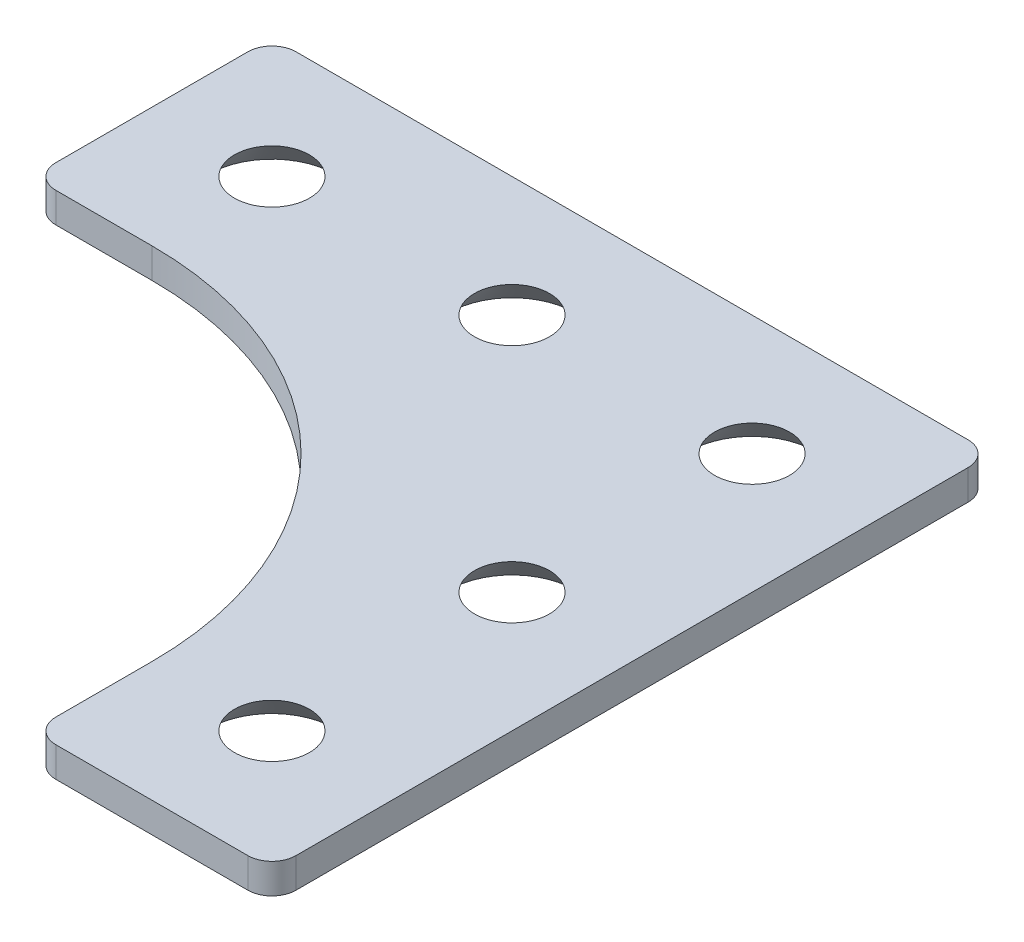
ISO-10303-21;
HEADER;
FILE_DESCRIPTION(('STEP AP214'),'2;1');
FILE_NAME('part.step','',(''),(''),'','','');
FILE_SCHEMA(('AUTOMOTIVE_DESIGN { 1 0 10303 214 1 1 1 1 }'));
ENDSEC;
DATA;
#1=APPLICATION_CONTEXT('core data for automotive mechanical design processes');
#2=APPLICATION_PROTOCOL_DEFINITION('international standard','automotive_design',2000,#1);
#3=PRODUCT_CONTEXT('',#1,'mechanical');
#4=PRODUCT('Part','Part','',(#3));
#5=PRODUCT_RELATED_PRODUCT_CATEGORY('part','',(#4));
#6=PRODUCT_DEFINITION_FORMATION('','',#4);
#7=PRODUCT_DEFINITION_CONTEXT('part definition',#1,'design');
#8=PRODUCT_DEFINITION('design','',#6,#7);
#9=PRODUCT_DEFINITION_SHAPE('','',#8);
#10=(LENGTH_UNIT() NAMED_UNIT(*) SI_UNIT(.MILLI.,.METRE.));
#11=(NAMED_UNIT(*) PLANE_ANGLE_UNIT() SI_UNIT($,.RADIAN.));
#12=(NAMED_UNIT(*) SI_UNIT($,.STERADIAN.) SOLID_ANGLE_UNIT());
#13=UNCERTAINTY_MEASURE_WITH_UNIT(LENGTH_MEASURE(1.E-05),#10,'distance_accuracy_value','');
#14=(GEOMETRIC_REPRESENTATION_CONTEXT(3) GLOBAL_UNCERTAINTY_ASSIGNED_CONTEXT((#13)) GLOBAL_UNIT_ASSIGNED_CONTEXT((#10,
#11,#12)) REPRESENTATION_CONTEXT('',''));
#15=CARTESIAN_POINT('',(0.,0.,0.));
#16=DIRECTION('',(0.,0.,1.));
#17=DIRECTION('',(1.,0.,0.));
#18=AXIS2_PLACEMENT_3D('',#15,#16,#17);
#19=CARTESIAN_POINT('',(274.893771244465,3.175,-266.67115375047));
#20=DIRECTION('',(0.,-1.,0.));
#21=DIRECTION('',(0.,0.,-1.));
#22=AXIS2_PLACEMENT_3D('',#19,#20,#21);
#23=PLANE('',#22);
#24=CARTESIAN_POINT('',(264.733771244466,3.175,-205.711153750467));
#25=DIRECTION('',(0.,-1.,0.));
#26=DIRECTION('',(0.,0.,-1.));
#27=AXIS2_PLACEMENT_3D('',#24,#25,#26);
#28=CIRCLE('',#27,3.97101460743346);
#29=CARTESIAN_POINT('',(264.733771244466,3.175,-209.682168357901));
#30=VERTEX_POINT('',#29);
#31=EDGE_CURVE('E47',#30,#30,#28,.T.);
#32=ORIENTED_EDGE('',*,*,#31,.T.);
#33=EDGE_LOOP('',(#32));
#34=FACE_BOUND('',#33,.T.);
#35=CARTESIAN_POINT('',(264.733771244466,3.175,-231.111153750467));
#36=DIRECTION('',(0.,-1.,0.));
#37=DIRECTION('',(0.,0.,-1.));
#38=AXIS2_PLACEMENT_3D('',#35,#36,#37);
#39=CIRCLE('',#38,3.97101460743346);
#40=CARTESIAN_POINT('',(264.733771244466,3.175,-235.082168357901));
#41=VERTEX_POINT('',#40);
#42=EDGE_CURVE('E238',#41,#41,#39,.T.);
#43=ORIENTED_EDGE('',*,*,#42,.T.);
#44=EDGE_LOOP('',(#43));
#45=FACE_BOUND('',#44,.T.);
#46=CARTESIAN_POINT('',(264.733771244466,3.175,-256.511153750471));
#47=DIRECTION('',(0.,-1.,0.));
#48=DIRECTION('',(0.,0.,-1.));
#49=AXIS2_PLACEMENT_3D('',#46,#47,#48);
#50=CIRCLE('',#49,3.97101460743346);
#51=CARTESIAN_POINT('',(264.733771244466,3.175,-260.482168357905));
#52=VERTEX_POINT('',#51);
#53=EDGE_CURVE('E248',#52,#52,#50,.T.);
#54=ORIENTED_EDGE('',*,*,#53,.T.);
#55=EDGE_LOOP('',(#54));
#56=FACE_BOUND('',#55,.T.);
#57=CARTESIAN_POINT('',(239.333771244467,3.175,-256.511153750469));
#58=DIRECTION('',(0.,-1.,0.));
#59=DIRECTION('',(0.,0.,-1.));
#60=AXIS2_PLACEMENT_3D('',#57,#58,#59);
#61=CIRCLE('',#60,3.97101460743349);
#62=CARTESIAN_POINT('',(239.333771244467,3.175,-260.482168357903));
#63=VERTEX_POINT('',#62);
#64=EDGE_CURVE('E266',#63,#63,#61,.T.);
#65=ORIENTED_EDGE('',*,*,#64,.T.);
#66=EDGE_LOOP('',(#65));
#67=FACE_BOUND('',#66,.T.);
#68=CARTESIAN_POINT('',(213.933771244467,3.175,-256.511153750469));
#69=DIRECTION('',(0.,-1.,0.));
#70=DIRECTION('',(0.,0.,-1.));
#71=AXIS2_PLACEMENT_3D('',#68,#69,#70);
#72=CIRCLE('',#71,3.97101460743349);
#73=CARTESIAN_POINT('',(213.933771244467,3.175,-260.482168357903));
#74=VERTEX_POINT('',#73);
#75=EDGE_CURVE('E175',#74,#74,#72,.T.);
#76=ORIENTED_EDGE('',*,*,#75,.T.);
#77=EDGE_LOOP('',(#76));
#78=FACE_BOUND('',#77,.T.);
#79=CARTESIAN_POINT('',(274.893771244465,3.175,-266.67115375047));
#80=DIRECTION('',(0.,1.,0.));
#81=DIRECTION('',(0.,0.,-1.));
#82=AXIS2_PLACEMENT_3D('',#79,#80,#81);
#83=CIRCLE('',#82,2.54000000000001);
#84=CARTESIAN_POINT('',(277.433771244465,3.175,-266.67115375047));
#85=VERTEX_POINT('',#84);
#86=CARTESIAN_POINT('',(274.893771244465,3.175,-269.21115375047));
#87=VERTEX_POINT('',#86);
#88=EDGE_CURVE('E205',#85,#87,#83,.T.);
#89=ORIENTED_EDGE('',*,*,#88,.T.);
#90=DIRECTION('',(-1.,0.,0.));
#91=VECTOR('',#90,1.);
#92=CARTESIAN_POINT('',(274.893771244465,3.175,-269.21115375047));
#93=LINE('',#92,#91);
#94=CARTESIAN_POINT('',(203.773771244465,3.175,-269.21115375047));
#95=VERTEX_POINT('',#94);
#96=EDGE_CURVE('E118',#87,#95,#93,.T.);
#97=ORIENTED_EDGE('',*,*,#96,.T.);
#98=CARTESIAN_POINT('',(203.773771244465,3.175,-266.67115375047));
#99=DIRECTION('',(0.,1.,0.));
#100=DIRECTION('',(0.,0.,-1.));
#101=AXIS2_PLACEMENT_3D('',#98,#99,#100);
#102=CIRCLE('',#101,2.53999999999999);
#103=CARTESIAN_POINT('',(201.233771244465,3.175,-266.67115375047));
#104=VERTEX_POINT('',#103);
#105=EDGE_CURVE('E281',#95,#104,#102,.T.);
#106=ORIENTED_EDGE('',*,*,#105,.T.);
#107=DIRECTION('',(0.,0.,1.));
#108=VECTOR('',#107,1.);
#109=CARTESIAN_POINT('',(201.233771244465,3.175,-266.67115375047));
#110=LINE('',#109,#108);
#111=CARTESIAN_POINT('',(201.233771244465,3.175,-246.351153750469));
#112=VERTEX_POINT('',#111);
#113=EDGE_CURVE('E284',#104,#112,#110,.T.);
#114=ORIENTED_EDGE('',*,*,#113,.T.);
#115=CARTESIAN_POINT('',(203.773771244465,3.175,-246.351153750469));
#116=DIRECTION('',(0.,1.,0.));
#117=DIRECTION('',(0.,0.,-1.));
#118=AXIS2_PLACEMENT_3D('',#115,#116,#117);
#119=CIRCLE('',#118,2.53999999999999);
#120=CARTESIAN_POINT('',(203.773771244465,3.175,-243.811153750469));
#121=VERTEX_POINT('',#120);
#122=EDGE_CURVE('E287',#112,#121,#119,.T.);
#123=ORIENTED_EDGE('',*,*,#122,.T.);
#124=DIRECTION('',(1.,0.,0.));
#125=VECTOR('',#124,1.);
#126=CARTESIAN_POINT('',(203.773771244465,3.175,-243.811153750469));
#127=LINE('',#126,#125);
#128=CARTESIAN_POINT('',(213.933771244466,3.175,-243.811153750469));
#129=VERTEX_POINT('',#128);
#130=EDGE_CURVE('E290',#121,#129,#127,.T.);
#131=ORIENTED_EDGE('',*,*,#130,.T.);
#132=CARTESIAN_POINT('',(213.933771244466,3.175,-205.711153750469));
#133=DIRECTION('',(0.,-1.,0.));
#134=DIRECTION('',(0.,0.,1.));
#135=AXIS2_PLACEMENT_3D('',#132,#133,#134);
#136=CIRCLE('',#135,38.1);
#137=CARTESIAN_POINT('',(252.033771244467,3.175,-205.711153750471));
#138=VERTEX_POINT('',#137);
#139=EDGE_CURVE('E293',#129,#138,#136,.T.);
#140=ORIENTED_EDGE('',*,*,#139,.T.);
#141=DIRECTION('',(0.,0.,1.));
#142=VECTOR('',#141,1.);
#143=CARTESIAN_POINT('',(252.033771244467,3.175,-205.711153750471));
#144=LINE('',#143,#142);
#145=CARTESIAN_POINT('',(252.033771244467,3.175,-195.551153750469));
#146=VERTEX_POINT('',#145);
#147=EDGE_CURVE('E296',#138,#146,#144,.T.);
#148=ORIENTED_EDGE('',*,*,#147,.T.);
#149=CARTESIAN_POINT('',(254.573771244467,3.175,-195.551153750469));
#150=DIRECTION('',(0.,1.,0.));
#151=DIRECTION('',(0.,0.,-1.));
#152=AXIS2_PLACEMENT_3D('',#149,#150,#151);
#153=CIRCLE('',#152,2.53999999999999);
#154=CARTESIAN_POINT('',(254.573771244467,3.175,-193.011153750469));
#155=VERTEX_POINT('',#154);
#156=EDGE_CURVE('E148',#146,#155,#153,.T.);
#157=ORIENTED_EDGE('',*,*,#156,.T.);
#158=DIRECTION('',(1.,0.,0.));
#159=VECTOR('',#158,1.);
#160=CARTESIAN_POINT('',(254.573771244467,3.175,-193.011153750469));
#161=LINE('',#160,#159);
#162=CARTESIAN_POINT('',(274.893771244467,3.175,-193.011153750469));
#163=VERTEX_POINT('',#162);
#164=EDGE_CURVE('E143',#155,#163,#161,.T.);
#165=ORIENTED_EDGE('',*,*,#164,.T.);
#166=CARTESIAN_POINT('',(274.893771244467,3.175,-195.551153750469));
#167=DIRECTION('',(0.,1.,0.));
#168=DIRECTION('',(0.,0.,-1.));
#169=AXIS2_PLACEMENT_3D('',#166,#167,#168);
#170=CIRCLE('',#169,2.54000000000001);
#171=CARTESIAN_POINT('',(277.433771244467,3.175,-195.551153750469));
#172=VERTEX_POINT('',#171);
#173=EDGE_CURVE('E146',#163,#172,#170,.T.);
#174=ORIENTED_EDGE('',*,*,#173,.T.);
#175=DIRECTION('',(0.,0.,-1.));
#176=VECTOR('',#175,1.);
#177=CARTESIAN_POINT('',(277.433771244467,3.175,-195.551153750469));
#178=LINE('',#177,#176);
#179=EDGE_CURVE('E63',#172,#85,#178,.T.);
#180=ORIENTED_EDGE('',*,*,#179,.T.);
#181=EDGE_LOOP('',(#89,#97,#106,#114,#123,#131,#140,#148,#157,#165,#174,#180));
#182=FACE_BOUND('',#181,.T.);
#183=ADVANCED_FACE('F43',(#34,#45,#56,#67,#78,#182),#23,.F.);
#184=CARTESIAN_POINT('',(274.893771244465,3.175,-266.67115375047));
#185=DIRECTION('',(0.,-1.,0.));
#186=DIRECTION('',(0.,0.,-1.));
#187=AXIS2_PLACEMENT_3D('',#184,#185,#186);
#188=CYLINDRICAL_SURFACE('',#187,2.54000000000001);
#189=CARTESIAN_POINT('',(274.893771244465,0.,-266.67115375047));
#190=DIRECTION('',(0.,1.,0.));
#191=DIRECTION('',(0.,0.,-1.));
#192=AXIS2_PLACEMENT_3D('',#189,#190,#191);
#193=CIRCLE('',#192,2.54000000000001);
#194=CARTESIAN_POINT('',(277.433771244465,0.,-266.67115375047));
#195=VERTEX_POINT('',#194);
#196=CARTESIAN_POINT('',(274.893771244465,0.,-269.21115375047));
#197=VERTEX_POINT('',#196);
#198=EDGE_CURVE('E170',#195,#197,#193,.T.);
#199=ORIENTED_EDGE('',*,*,#198,.T.);
#200=DIRECTION('',(0.,-1.,0.));
#201=VECTOR('',#200,1.);
#202=CARTESIAN_POINT('',(274.893771244465,3.175,-269.21115375047));
#203=LINE('',#202,#201);
#204=EDGE_CURVE('E11',#87,#197,#203,.T.);
#205=ORIENTED_EDGE('',*,*,#204,.F.);
#206=ORIENTED_EDGE('',*,*,#88,.F.);
#207=DIRECTION('',(0.,-1.,0.));
#208=VECTOR('',#207,1.);
#209=CARTESIAN_POINT('',(277.433771244465,3.175,-266.67115375047));
#210=LINE('',#209,#208);
#211=EDGE_CURVE('E166',#85,#195,#210,.T.);
#212=ORIENTED_EDGE('',*,*,#211,.T.);
#213=EDGE_LOOP('',(#199,#205,#206,#212));
#214=FACE_BOUND('',#213,.T.);
#215=ADVANCED_FACE('F45',(#214),#188,.T.);
#216=CARTESIAN_POINT('',(274.893771244465,3.175,-269.21115375047));
#217=DIRECTION('',(0.,0.,1.));
#218=DIRECTION('',(1.,0.,0.));
#219=AXIS2_PLACEMENT_3D('',#216,#217,#218);
#220=PLANE('',#219);
#221=DIRECTION('',(-1.,0.,0.));
#222=VECTOR('',#221,1.);
#223=CARTESIAN_POINT('',(274.893771244465,0.,-269.21115375047));
#224=LINE('',#223,#222);
#225=CARTESIAN_POINT('',(203.773771244465,0.,-269.21115375047));
#226=VERTEX_POINT('',#225);
#227=EDGE_CURVE('E174',#197,#226,#224,.T.);
#228=ORIENTED_EDGE('',*,*,#227,.T.);
#229=DIRECTION('',(0.,-1.,0.));
#230=VECTOR('',#229,1.);
#231=CARTESIAN_POINT('',(203.773771244465,3.175,-269.21115375047));
#232=LINE('',#231,#230);
#233=EDGE_CURVE('E54',#95,#226,#232,.T.);
#234=ORIENTED_EDGE('',*,*,#233,.F.);
#235=ORIENTED_EDGE('',*,*,#96,.F.);
#236=ORIENTED_EDGE('',*,*,#204,.T.);
#237=EDGE_LOOP('',(#228,#234,#235,#236));
#238=FACE_BOUND('',#237,.T.);
#239=ADVANCED_FACE('F333',(#238),#220,.F.);
#240=CARTESIAN_POINT('',(203.773771244465,3.175,-266.67115375047));
#241=DIRECTION('',(0.,-1.,0.));
#242=DIRECTION('',(0.,0.,-1.));
#243=AXIS2_PLACEMENT_3D('',#240,#241,#242);
#244=CYLINDRICAL_SURFACE('',#243,2.53999999999999);
#245=CARTESIAN_POINT('',(203.773771244465,0.,-266.67115375047));
#246=DIRECTION('',(0.,1.,0.));
#247=DIRECTION('',(0.,0.,-1.));
#248=AXIS2_PLACEMENT_3D('',#245,#246,#247);
#249=CIRCLE('',#248,2.53999999999999);
#250=CARTESIAN_POINT('',(201.233771244465,0.,-266.67115375047));
#251=VERTEX_POINT('',#250);
#252=EDGE_CURVE('E178',#226,#251,#249,.T.);
#253=ORIENTED_EDGE('',*,*,#252,.T.);
#254=DIRECTION('',(0.,-1.,0.));
#255=VECTOR('',#254,1.);
#256=CARTESIAN_POINT('',(201.233771244465,3.175,-266.67115375047));
#257=LINE('',#256,#255);
#258=EDGE_CURVE('E232',#104,#251,#257,.T.);
#259=ORIENTED_EDGE('',*,*,#258,.F.);
#260=ORIENTED_EDGE('',*,*,#105,.F.);
#261=ORIENTED_EDGE('',*,*,#233,.T.);
#262=EDGE_LOOP('',(#253,#259,#260,#261));
#263=FACE_BOUND('',#262,.T.);
#264=ADVANCED_FACE('F483',(#263),#244,.T.);
#265=CARTESIAN_POINT('',(201.233771244465,3.175,-266.67115375047));
#266=DIRECTION('',(1.,0.,0.));
#267=DIRECTION('',(0.,0.,-1.));
#268=AXIS2_PLACEMENT_3D('',#265,#266,#267);
#269=PLANE('',#268);
#270=DIRECTION('',(0.,0.,1.));
#271=VECTOR('',#270,1.);
#272=CARTESIAN_POINT('',(201.233771244465,0.,-266.67115375047));
#273=LINE('',#272,#271);
#274=CARTESIAN_POINT('',(201.233771244465,0.,-246.351153750469));
#275=VERTEX_POINT('',#274);
#276=EDGE_CURVE('E181',#251,#275,#273,.T.);
#277=ORIENTED_EDGE('',*,*,#276,.T.);
#278=DIRECTION('',(0.,-1.,0.));
#279=VECTOR('',#278,1.);
#280=CARTESIAN_POINT('',(201.233771244465,3.175,-246.351153750469));
#281=LINE('',#280,#279);
#282=EDGE_CURVE('E228',#112,#275,#281,.T.);
#283=ORIENTED_EDGE('',*,*,#282,.F.);
#284=ORIENTED_EDGE('',*,*,#113,.F.);
#285=ORIENTED_EDGE('',*,*,#258,.T.);
#286=EDGE_LOOP('',(#277,#283,#284,#285));
#287=FACE_BOUND('',#286,.T.);
#288=ADVANCED_FACE('F472',(#287),#269,.F.);
#289=CARTESIAN_POINT('',(203.773771244465,3.175,-246.351153750469));
#290=DIRECTION('',(0.,-1.,0.));
#291=DIRECTION('',(0.,0.,-1.));
#292=AXIS2_PLACEMENT_3D('',#289,#290,#291);
#293=CYLINDRICAL_SURFACE('',#292,2.53999999999999);
#294=CARTESIAN_POINT('',(203.773771244465,0.,-246.351153750469));
#295=DIRECTION('',(0.,1.,0.));
#296=DIRECTION('',(0.,0.,-1.));
#297=AXIS2_PLACEMENT_3D('',#294,#295,#296);
#298=CIRCLE('',#297,2.53999999999999);
#299=CARTESIAN_POINT('',(203.773771244465,0.,-243.811153750469));
#300=VERTEX_POINT('',#299);
#301=EDGE_CURVE('E184',#275,#300,#298,.T.);
#302=ORIENTED_EDGE('',*,*,#301,.T.);
#303=DIRECTION('',(0.,-1.,0.));
#304=VECTOR('',#303,1.);
#305=CARTESIAN_POINT('',(203.773771244465,3.175,-243.811153750469));
#306=LINE('',#305,#304);
#307=EDGE_CURVE('E224',#121,#300,#306,.T.);
#308=ORIENTED_EDGE('',*,*,#307,.F.);
#309=ORIENTED_EDGE('',*,*,#122,.F.);
#310=ORIENTED_EDGE('',*,*,#282,.T.);
#311=EDGE_LOOP('',(#302,#308,#309,#310));
#312=FACE_BOUND('',#311,.T.);
#313=ADVANCED_FACE('F461',(#312),#293,.T.);
#314=CARTESIAN_POINT('',(203.773771244465,3.175,-243.811153750469));
#315=DIRECTION('',(0.,0.,-1.));
#316=DIRECTION('',(-1.,0.,0.));
#317=AXIS2_PLACEMENT_3D('',#314,#315,#316);
#318=PLANE('',#317);
#319=DIRECTION('',(1.,0.,0.));
#320=VECTOR('',#319,1.);
#321=CARTESIAN_POINT('',(203.773771244465,0.,-243.811153750469));
#322=LINE('',#321,#320);
#323=CARTESIAN_POINT('',(213.933771244466,0.,-243.811153750469));
#324=VERTEX_POINT('',#323);
#325=EDGE_CURVE('E187',#300,#324,#322,.T.);
#326=ORIENTED_EDGE('',*,*,#325,.T.);
#327=DIRECTION('',(0.,-1.,0.));
#328=VECTOR('',#327,1.);
#329=CARTESIAN_POINT('',(213.933771244466,3.175,-243.811153750469));
#330=LINE('',#329,#328);
#331=EDGE_CURVE('E220',#129,#324,#330,.T.);
#332=ORIENTED_EDGE('',*,*,#331,.F.);
#333=ORIENTED_EDGE('',*,*,#130,.F.);
#334=ORIENTED_EDGE('',*,*,#307,.T.);
#335=EDGE_LOOP('',(#326,#332,#333,#334));
#336=FACE_BOUND('',#335,.T.);
#337=ADVANCED_FACE('F450',(#336),#318,.F.);
#338=CARTESIAN_POINT('',(213.933771244466,3.175,-205.711153750469));
#339=DIRECTION('',(0.,-1.,0.));
#340=DIRECTION('',(0.,0.,-1.));
#341=AXIS2_PLACEMENT_3D('',#338,#339,#340);
#342=CYLINDRICAL_SURFACE('',#341,38.1);
#343=CARTESIAN_POINT('',(213.933771244466,0.,-205.711153750469));
#344=DIRECTION('',(0.,-1.,0.));
#345=DIRECTION('',(0.,0.,1.));
#346=AXIS2_PLACEMENT_3D('',#343,#344,#345);
#347=CIRCLE('',#346,38.1);
#348=CARTESIAN_POINT('',(252.033771244467,0.,-205.711153750471));
#349=VERTEX_POINT('',#348);
#350=EDGE_CURVE('E190',#324,#349,#347,.T.);
#351=ORIENTED_EDGE('',*,*,#350,.T.);
#352=DIRECTION('',(0.,-1.,0.));
#353=VECTOR('',#352,1.);
#354=CARTESIAN_POINT('',(252.033771244467,3.175,-205.711153750471));
#355=LINE('',#354,#353);
#356=EDGE_CURVE('E216',#138,#349,#355,.T.);
#357=ORIENTED_EDGE('',*,*,#356,.F.);
#358=ORIENTED_EDGE('',*,*,#139,.F.);
#359=ORIENTED_EDGE('',*,*,#331,.T.);
#360=EDGE_LOOP('',(#351,#357,#358,#359));
#361=FACE_BOUND('',#360,.T.);
#362=ADVANCED_FACE('F440',(#361),#342,.F.);
#363=CARTESIAN_POINT('',(252.033771244467,3.175,-205.711153750471));
#364=DIRECTION('',(1.,0.,0.));
#365=DIRECTION('',(0.,0.,-1.));
#366=AXIS2_PLACEMENT_3D('',#363,#364,#365);
#367=PLANE('',#366);
#368=DIRECTION('',(0.,0.,1.));
#369=VECTOR('',#368,1.);
#370=CARTESIAN_POINT('',(252.033771244467,0.,-205.711153750471));
#371=LINE('',#370,#369);
#372=CARTESIAN_POINT('',(252.033771244467,0.,-195.551153750469));
#373=VERTEX_POINT('',#372);
#374=EDGE_CURVE('E193',#349,#373,#371,.T.);
#375=ORIENTED_EDGE('',*,*,#374,.T.);
#376=DIRECTION('',(0.,-1.,0.));
#377=VECTOR('',#376,1.);
#378=CARTESIAN_POINT('',(252.033771244467,3.175,-195.551153750469));
#379=LINE('',#378,#377);
#380=EDGE_CURVE('E212',#146,#373,#379,.T.);
#381=ORIENTED_EDGE('',*,*,#380,.F.);
#382=ORIENTED_EDGE('',*,*,#147,.F.);
#383=ORIENTED_EDGE('',*,*,#356,.T.);
#384=EDGE_LOOP('',(#375,#381,#382,#383));
#385=FACE_BOUND('',#384,.T.);
#386=ADVANCED_FACE('F304',(#385),#367,.F.);
#387=CARTESIAN_POINT('',(254.573771244467,3.175,-195.551153750469));
#388=DIRECTION('',(0.,-1.,0.));
#389=DIRECTION('',(0.,0.,-1.));
#390=AXIS2_PLACEMENT_3D('',#387,#388,#389);
#391=CYLINDRICAL_SURFACE('',#390,2.53999999999999);
#392=CARTESIAN_POINT('',(254.573771244467,0.,-195.551153750469));
#393=DIRECTION('',(0.,1.,0.));
#394=DIRECTION('',(0.,0.,-1.));
#395=AXIS2_PLACEMENT_3D('',#392,#393,#394);
#396=CIRCLE('',#395,2.53999999999999);
#397=CARTESIAN_POINT('',(254.573771244467,0.,-193.011153750469));
#398=VERTEX_POINT('',#397);
#399=EDGE_CURVE('E196',#373,#398,#396,.T.);
#400=ORIENTED_EDGE('',*,*,#399,.T.);
#401=DIRECTION('',(0.,-1.,0.));
#402=VECTOR('',#401,1.);
#403=CARTESIAN_POINT('',(254.573771244467,3.175,-193.011153750469));
#404=LINE('',#403,#402);
#405=EDGE_CURVE('E159',#155,#398,#404,.T.);
#406=ORIENTED_EDGE('',*,*,#405,.F.);
#407=ORIENTED_EDGE('',*,*,#156,.F.);
#408=ORIENTED_EDGE('',*,*,#380,.T.);
#409=EDGE_LOOP('',(#400,#406,#407,#408));
#410=FACE_BOUND('',#409,.T.);
#411=ADVANCED_FACE('F308',(#410),#391,.T.);
#412=CARTESIAN_POINT('',(254.573771244467,3.175,-193.011153750469));
#413=DIRECTION('',(0.,0.,-1.));
#414=DIRECTION('',(-1.,0.,0.));
#415=AXIS2_PLACEMENT_3D('',#412,#413,#414);
#416=PLANE('',#415);
#417=DIRECTION('',(1.,0.,0.));
#418=VECTOR('',#417,1.);
#419=CARTESIAN_POINT('',(254.573771244467,0.,-193.011153750469));
#420=LINE('',#419,#418);
#421=CARTESIAN_POINT('',(274.893771244467,0.,-193.011153750469));
#422=VERTEX_POINT('',#421);
#423=EDGE_CURVE('E157',#398,#422,#420,.T.);
#424=ORIENTED_EDGE('',*,*,#423,.T.);
#425=DIRECTION('',(0.,-1.,0.));
#426=VECTOR('',#425,1.);
#427=CARTESIAN_POINT('',(274.893771244467,3.175,-193.011153750469));
#428=LINE('',#427,#426);
#429=EDGE_CURVE('E154',#163,#422,#428,.T.);
#430=ORIENTED_EDGE('',*,*,#429,.F.);
#431=ORIENTED_EDGE('',*,*,#164,.F.);
#432=ORIENTED_EDGE('',*,*,#405,.T.);
#433=EDGE_LOOP('',(#424,#430,#431,#432));
#434=FACE_BOUND('',#433,.T.);
#435=ADVANCED_FACE('F155',(#434),#416,.F.);
#436=CARTESIAN_POINT('',(274.893771244467,3.175,-195.551153750469));
#437=DIRECTION('',(0.,-1.,0.));
#438=DIRECTION('',(0.,0.,-1.));
#439=AXIS2_PLACEMENT_3D('',#436,#437,#438);
#440=CYLINDRICAL_SURFACE('',#439,2.54000000000001);
#441=CARTESIAN_POINT('',(274.893771244467,0.,-195.551153750469));
#442=DIRECTION('',(0.,1.,0.));
#443=DIRECTION('',(0.,0.,-1.));
#444=AXIS2_PLACEMENT_3D('',#441,#442,#443);
#445=CIRCLE('',#444,2.54000000000001);
#446=CARTESIAN_POINT('',(277.433771244467,0.,-195.551153750469));
#447=VERTEX_POINT('',#446);
#448=EDGE_CURVE('E104',#422,#447,#445,.T.);
#449=ORIENTED_EDGE('',*,*,#448,.T.);
#450=DIRECTION('',(0.,-1.,0.));
#451=VECTOR('',#450,1.);
#452=CARTESIAN_POINT('',(277.433771244467,3.175,-195.551153750469));
#453=LINE('',#452,#451);
#454=EDGE_CURVE('E160',#172,#447,#453,.T.);
#455=ORIENTED_EDGE('',*,*,#454,.F.);
#456=ORIENTED_EDGE('',*,*,#173,.F.);
#457=ORIENTED_EDGE('',*,*,#429,.T.);
#458=EDGE_LOOP('',(#449,#455,#456,#457));
#459=FACE_BOUND('',#458,.T.);
#460=ADVANCED_FACE('F162',(#459),#440,.T.);
#461=CARTESIAN_POINT('',(277.433771244467,3.175,-195.551153750469));
#462=DIRECTION('',(-1.,0.,0.));
#463=DIRECTION('',(0.,0.,1.));
#464=AXIS2_PLACEMENT_3D('',#461,#462,#463);
#465=PLANE('',#464);
#466=DIRECTION('',(0.,0.,-1.));
#467=VECTOR('',#466,1.);
#468=CARTESIAN_POINT('',(277.433771244467,0.,-195.551153750469));
#469=LINE('',#468,#467);
#470=EDGE_CURVE('E110',#447,#195,#469,.T.);
#471=ORIENTED_EDGE('',*,*,#470,.T.);
#472=ORIENTED_EDGE('',*,*,#211,.F.);
#473=ORIENTED_EDGE('',*,*,#179,.F.);
#474=ORIENTED_EDGE('',*,*,#454,.T.);
#475=EDGE_LOOP('',(#471,#472,#473,#474));
#476=FACE_BOUND('',#475,.T.);
#477=ADVANCED_FACE('F316',(#476),#465,.F.);
#478=CARTESIAN_POINT('',(274.893771244465,0.,-266.67115375047));
#479=DIRECTION('',(0.,-1.,0.));
#480=DIRECTION('',(0.,0.,-1.));
#481=AXIS2_PLACEMENT_3D('',#478,#479,#480);
#482=PLANE('',#481);
#483=CARTESIAN_POINT('',(264.733771244466,0.,-205.711153750467));
#484=DIRECTION('',(0.,-1.,0.));
#485=DIRECTION('',(0.,0.,-1.));
#486=AXIS2_PLACEMENT_3D('',#483,#484,#485);
#487=CIRCLE('',#486,6.73099999999999);
#488=CARTESIAN_POINT('',(264.733771244466,0.,-212.442153750467));
#489=VERTEX_POINT('',#488);
#490=EDGE_CURVE('E256',#489,#489,#487,.T.);
#491=ORIENTED_EDGE('',*,*,#490,.F.);
#492=EDGE_LOOP('',(#491));
#493=FACE_BOUND('',#492,.T.);
#494=CARTESIAN_POINT('',(264.733771244466,0.,-231.111153750467));
#495=DIRECTION('',(0.,-1.,0.));
#496=DIRECTION('',(0.,0.,-1.));
#497=AXIS2_PLACEMENT_3D('',#494,#495,#496);
#498=CIRCLE('',#497,6.73099999999999);
#499=CARTESIAN_POINT('',(264.733771244466,0.,-237.842153750467));
#500=VERTEX_POINT('',#499);
#501=EDGE_CURVE('E242',#500,#500,#498,.T.);
#502=ORIENTED_EDGE('',*,*,#501,.F.);
#503=EDGE_LOOP('',(#502));
#504=FACE_BOUND('',#503,.T.);
#505=CARTESIAN_POINT('',(264.733771244466,0.,-256.511153750471));
#506=DIRECTION('',(0.,-1.,0.));
#507=DIRECTION('',(0.,0.,-1.));
#508=AXIS2_PLACEMENT_3D('',#505,#506,#507);
#509=CIRCLE('',#508,6.73099999999999);
#510=CARTESIAN_POINT('',(264.733771244466,0.,-263.242153750471));
#511=VERTEX_POINT('',#510);
#512=EDGE_CURVE('E241',#511,#511,#509,.T.);
#513=ORIENTED_EDGE('',*,*,#512,.F.);
#514=EDGE_LOOP('',(#513));
#515=FACE_BOUND('',#514,.T.);
#516=CARTESIAN_POINT('',(239.333771244467,0.,-256.511153750469));
#517=DIRECTION('',(0.,-1.,0.));
#518=DIRECTION('',(0.,0.,-1.));
#519=AXIS2_PLACEMENT_3D('',#516,#517,#518);
#520=CIRCLE('',#519,6.73099999999999);
#521=CARTESIAN_POINT('',(239.333771244467,0.,-263.242153750469));
#522=VERTEX_POINT('',#521);
#523=EDGE_CURVE('E262',#522,#522,#520,.T.);
#524=ORIENTED_EDGE('',*,*,#523,.F.);
#525=EDGE_LOOP('',(#524));
#526=FACE_BOUND('',#525,.T.);
#527=CARTESIAN_POINT('',(213.933771244467,0.,-256.511153750469));
#528=DIRECTION('',(0.,-1.,0.));
#529=DIRECTION('',(0.,0.,-1.));
#530=AXIS2_PLACEMENT_3D('',#527,#528,#529);
#531=CIRCLE('',#530,6.73099999999999);
#532=CARTESIAN_POINT('',(213.933771244467,0.,-263.242153750469));
#533=VERTEX_POINT('',#532);
#534=EDGE_CURVE('E270',#533,#533,#531,.T.);
#535=ORIENTED_EDGE('',*,*,#534,.F.);
#536=EDGE_LOOP('',(#535));
#537=FACE_BOUND('',#536,.T.);
#538=ORIENTED_EDGE('',*,*,#198,.F.);
#539=ORIENTED_EDGE('',*,*,#470,.F.);
#540=ORIENTED_EDGE('',*,*,#448,.F.);
#541=ORIENTED_EDGE('',*,*,#423,.F.);
#542=ORIENTED_EDGE('',*,*,#399,.F.);
#543=ORIENTED_EDGE('',*,*,#374,.F.);
#544=ORIENTED_EDGE('',*,*,#350,.F.);
#545=ORIENTED_EDGE('',*,*,#325,.F.);
#546=ORIENTED_EDGE('',*,*,#301,.F.);
#547=ORIENTED_EDGE('',*,*,#276,.F.);
#548=ORIENTED_EDGE('',*,*,#252,.F.);
#549=ORIENTED_EDGE('',*,*,#227,.F.);
#550=EDGE_LOOP('',(#538,#539,#540,#541,#542,#543,#544,#545,#546,#547,#548,#549));
#551=FACE_BOUND('',#550,.T.);
#552=ADVANCED_FACE('F311',(#493,#504,#515,#526,#537,#551),#482,.T.);
#553=CARTESIAN_POINT('',(213.933771244467,0.,-256.511153750469));
#554=DIRECTION('',(0.,-1.,0.));
#555=DIRECTION('',(0.,0.,-1.));
#556=AXIS2_PLACEMENT_3D('',#553,#554,#555);
#557=CONICAL_SURFACE('',#556,6.73099999999999,0.715584993317671);
#558=ORIENTED_EDGE('',*,*,#534,.T.);
#559=EDGE_LOOP('',(#558));
#560=FACE_BOUND('',#559,.T.);
#561=ORIENTED_EDGE('',*,*,#75,.F.);
#562=EDGE_LOOP('',(#561));
#563=FACE_BOUND('',#562,.T.);
#564=ADVANCED_FACE('F323',(#560,#563),#557,.F.);
#565=CARTESIAN_POINT('',(239.333771244467,0.,-256.511153750469));
#566=DIRECTION('',(0.,-1.,0.));
#567=DIRECTION('',(0.,0.,-1.));
#568=AXIS2_PLACEMENT_3D('',#565,#566,#567);
#569=CONICAL_SURFACE('',#568,6.73099999999999,0.715584993317671);
#570=ORIENTED_EDGE('',*,*,#523,.T.);
#571=EDGE_LOOP('',(#570));
#572=FACE_BOUND('',#571,.T.);
#573=ORIENTED_EDGE('',*,*,#64,.F.);
#574=EDGE_LOOP('',(#573));
#575=FACE_BOUND('',#574,.T.);
#576=ADVANCED_FACE('F337',(#572,#575),#569,.F.);
#577=CARTESIAN_POINT('',(264.733771244466,0.,-256.511153750471));
#578=DIRECTION('',(0.,-1.,0.));
#579=DIRECTION('',(0.,0.,-1.));
#580=AXIS2_PLACEMENT_3D('',#577,#578,#579);
#581=CONICAL_SURFACE('',#580,6.73099999999999,0.715584993317675);
#582=ORIENTED_EDGE('',*,*,#512,.T.);
#583=EDGE_LOOP('',(#582));
#584=FACE_BOUND('',#583,.T.);
#585=ORIENTED_EDGE('',*,*,#53,.F.);
#586=EDGE_LOOP('',(#585));
#587=FACE_BOUND('',#586,.T.);
#588=ADVANCED_FACE('F341',(#584,#587),#581,.F.);
#589=CARTESIAN_POINT('',(264.733771244466,0.,-231.111153750467));
#590=DIRECTION('',(0.,-1.,0.));
#591=DIRECTION('',(0.,0.,-1.));
#592=AXIS2_PLACEMENT_3D('',#589,#590,#591);
#593=CONICAL_SURFACE('',#592,6.73099999999999,0.715584993317675);
#594=ORIENTED_EDGE('',*,*,#501,.T.);
#595=EDGE_LOOP('',(#594));
#596=FACE_BOUND('',#595,.T.);
#597=ORIENTED_EDGE('',*,*,#42,.F.);
#598=EDGE_LOOP('',(#597));
#599=FACE_BOUND('',#598,.T.);
#600=ADVANCED_FACE('F345',(#596,#599),#593,.F.);
#601=CARTESIAN_POINT('',(264.733771244466,0.,-205.711153750467));
#602=DIRECTION('',(0.,-1.,0.));
#603=DIRECTION('',(0.,0.,-1.));
#604=AXIS2_PLACEMENT_3D('',#601,#602,#603);
#605=CONICAL_SURFACE('',#604,6.73099999999999,0.715584993317675);
#606=ORIENTED_EDGE('',*,*,#490,.T.);
#607=EDGE_LOOP('',(#606));
#608=FACE_BOUND('',#607,.T.);
#609=ORIENTED_EDGE('',*,*,#31,.F.);
#610=EDGE_LOOP('',(#609));
#611=FACE_BOUND('',#610,.T.);
#612=ADVANCED_FACE('F349',(#608,#611),#605,.F.);
#613=CLOSED_SHELL('',(#183,#215,#239,#264,#288,#313,#337,#362,#386,#411,#435,#460,#477,#552,
#564,#576,#588,#600,#612));
#614=MANIFOLD_SOLID_BREP('B2',#613);
#615=ADVANCED_BREP_SHAPE_REPRESENTATION('',(#18,#614),#14);
#616=SHAPE_DEFINITION_REPRESENTATION(#9,#615);
ENDSEC;
END-ISO-10303-21;
